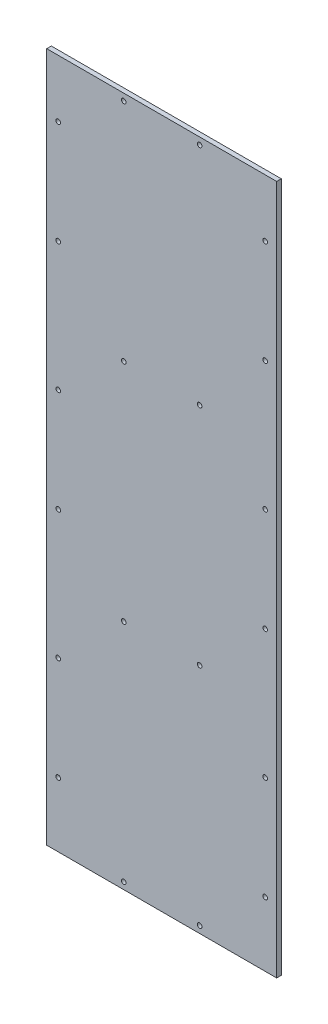
ISO-10303-21;
HEADER;
FILE_DESCRIPTION(('STEP AP214'),'2;1');
FILE_NAME('part.step','',(''),(''),'','','');
FILE_SCHEMA(('AUTOMOTIVE_DESIGN { 1 0 10303 214 1 1 1 1 }'));
ENDSEC;
DATA;
#1=APPLICATION_CONTEXT('core data for automotive mechanical design processes');
#2=APPLICATION_PROTOCOL_DEFINITION('international standard','automotive_design',2000,#1);
#3=PRODUCT_CONTEXT('',#1,'mechanical');
#4=PRODUCT('Part','Part','',(#3));
#5=PRODUCT_RELATED_PRODUCT_CATEGORY('part','',(#4));
#6=PRODUCT_DEFINITION_FORMATION('','',#4);
#7=PRODUCT_DEFINITION_CONTEXT('part definition',#1,'design');
#8=PRODUCT_DEFINITION('design','',#6,#7);
#9=PRODUCT_DEFINITION_SHAPE('','',#8);
#10=(LENGTH_UNIT() NAMED_UNIT(*) SI_UNIT(.MILLI.,.METRE.));
#11=(NAMED_UNIT(*) PLANE_ANGLE_UNIT() SI_UNIT($,.RADIAN.));
#12=(NAMED_UNIT(*) SI_UNIT($,.STERADIAN.) SOLID_ANGLE_UNIT());
#13=UNCERTAINTY_MEASURE_WITH_UNIT(LENGTH_MEASURE(1.E-05),#10,'distance_accuracy_value','');
#14=(GEOMETRIC_REPRESENTATION_CONTEXT(3) GLOBAL_UNCERTAINTY_ASSIGNED_CONTEXT((#13)) GLOBAL_UNIT_ASSIGNED_CONTEXT((#10,
#11,#12)) REPRESENTATION_CONTEXT('',''));
#15=CARTESIAN_POINT('',(0.,0.,0.));
#16=DIRECTION('',(0.,0.,1.));
#17=DIRECTION('',(1.,0.,0.));
#18=AXIS2_PLACEMENT_3D('',#15,#16,#17);
#19=CARTESIAN_POINT('',(-50.,-150.,2.));
#20=DIRECTION('',(1.,0.,0.));
#21=DIRECTION('',(0.,0.,-1.));
#22=AXIS2_PLACEMENT_3D('',#19,#20,#21);
#23=PLANE('',#22);
#24=DIRECTION('',(0.,-1.,0.));
#25=VECTOR('',#24,1.);
#26=CARTESIAN_POINT('',(-50.,-150.,0.));
#27=LINE('',#26,#25);
#28=CARTESIAN_POINT('',(-50.,150.,0.));
#29=VERTEX_POINT('',#28);
#30=CARTESIAN_POINT('',(-50.,-150.,0.));
#31=VERTEX_POINT('',#30);
#32=EDGE_CURVE('E104',#29,#31,#27,.T.);
#33=ORIENTED_EDGE('',*,*,#32,.T.);
#34=DIRECTION('',(0.,0.,-1.));
#35=VECTOR('',#34,1.);
#36=CARTESIAN_POINT('',(-50.,-150.,2.));
#37=LINE('',#36,#35);
#38=CARTESIAN_POINT('',(-50.,-150.,2.));
#39=VERTEX_POINT('',#38);
#40=EDGE_CURVE('E11',#39,#31,#37,.T.);
#41=ORIENTED_EDGE('',*,*,#40,.F.);
#42=DIRECTION('',(0.,-1.,0.));
#43=VECTOR('',#42,1.);
#44=CARTESIAN_POINT('',(-50.,-150.,2.));
#45=LINE('',#44,#43);
#46=CARTESIAN_POINT('',(-50.,150.,2.));
#47=VERTEX_POINT('',#46);
#48=EDGE_CURVE('E91',#47,#39,#45,.T.);
#49=ORIENTED_EDGE('',*,*,#48,.F.);
#50=DIRECTION('',(0.,0.,-1.));
#51=VECTOR('',#50,1.);
#52=CARTESIAN_POINT('',(-50.,150.,2.));
#53=LINE('',#52,#51);
#54=EDGE_CURVE('E100',#47,#29,#53,.T.);
#55=ORIENTED_EDGE('',*,*,#54,.T.);
#56=EDGE_LOOP('',(#33,#41,#49,#55));
#57=FACE_BOUND('',#56,.T.);
#58=ADVANCED_FACE('F38',(#57),#23,.F.);
#59=CARTESIAN_POINT('',(50.,-150.,2.));
#60=DIRECTION('',(0.,1.,0.));
#61=DIRECTION('',(0.,0.,1.));
#62=AXIS2_PLACEMENT_3D('',#59,#60,#61);
#63=PLANE('',#62);
#64=DIRECTION('',(1.,0.,0.));
#65=VECTOR('',#64,1.);
#66=CARTESIAN_POINT('',(50.,-150.,0.));
#67=LINE('',#66,#65);
#68=CARTESIAN_POINT('',(50.,-150.,0.));
#69=VERTEX_POINT('',#68);
#70=EDGE_CURVE('E95',#31,#69,#67,.T.);
#71=ORIENTED_EDGE('',*,*,#70,.T.);
#72=DIRECTION('',(0.,0.,-1.));
#73=VECTOR('',#72,1.);
#74=CARTESIAN_POINT('',(50.,-150.,2.));
#75=LINE('',#74,#73);
#76=CARTESIAN_POINT('',(50.,-150.,2.));
#77=VERTEX_POINT('',#76);
#78=EDGE_CURVE('E47',#77,#69,#75,.T.);
#79=ORIENTED_EDGE('',*,*,#78,.F.);
#80=DIRECTION('',(1.,0.,0.));
#81=VECTOR('',#80,1.);
#82=CARTESIAN_POINT('',(50.,-150.,2.));
#83=LINE('',#82,#81);
#84=EDGE_CURVE('E86',#39,#77,#83,.T.);
#85=ORIENTED_EDGE('',*,*,#84,.F.);
#86=ORIENTED_EDGE('',*,*,#40,.T.);
#87=EDGE_LOOP('',(#71,#79,#85,#86));
#88=FACE_BOUND('',#87,.T.);
#89=ADVANCED_FACE('F94',(#88),#63,.F.);
#90=CARTESIAN_POINT('',(50.,-150.,2.));
#91=DIRECTION('',(-1.,0.,0.));
#92=DIRECTION('',(0.,0.,1.));
#93=AXIS2_PLACEMENT_3D('',#90,#91,#92);
#94=PLANE('',#93);
#95=DIRECTION('',(0.,1.,0.));
#96=VECTOR('',#95,1.);
#97=CARTESIAN_POINT('',(50.,-150.,0.));
#98=LINE('',#97,#96);
#99=CARTESIAN_POINT('',(50.,150.,0.));
#100=VERTEX_POINT('',#99);
#101=EDGE_CURVE('E73',#69,#100,#98,.T.);
#102=ORIENTED_EDGE('',*,*,#101,.T.);
#103=DIRECTION('',(0.,0.,-1.));
#104=VECTOR('',#103,1.);
#105=CARTESIAN_POINT('',(50.,150.,2.));
#106=LINE('',#105,#104);
#107=CARTESIAN_POINT('',(50.,150.,2.));
#108=VERTEX_POINT('',#107);
#109=EDGE_CURVE('E96',#108,#100,#106,.T.);
#110=ORIENTED_EDGE('',*,*,#109,.F.);
#111=DIRECTION('',(0.,1.,0.));
#112=VECTOR('',#111,1.);
#113=CARTESIAN_POINT('',(50.,-150.,2.));
#114=LINE('',#113,#112);
#115=EDGE_CURVE('E89',#77,#108,#114,.T.);
#116=ORIENTED_EDGE('',*,*,#115,.F.);
#117=ORIENTED_EDGE('',*,*,#78,.T.);
#118=EDGE_LOOP('',(#102,#110,#116,#117));
#119=FACE_BOUND('',#118,.T.);
#120=ADVANCED_FACE('F98',(#119),#94,.F.);
#121=CARTESIAN_POINT('',(50.,150.,2.));
#122=DIRECTION('',(0.,-1.,0.));
#123=DIRECTION('',(1.,0.,0.));
#124=AXIS2_PLACEMENT_3D('',#121,#122,#123);
#125=PLANE('',#124);
#126=DIRECTION('',(-1.,0.,0.));
#127=VECTOR('',#126,1.);
#128=CARTESIAN_POINT('',(50.,150.,0.));
#129=LINE('',#128,#127);
#130=EDGE_CURVE('E79',#100,#29,#129,.T.);
#131=ORIENTED_EDGE('',*,*,#130,.T.);
#132=ORIENTED_EDGE('',*,*,#54,.F.);
#133=DIRECTION('',(-1.,0.,0.));
#134=VECTOR('',#133,1.);
#135=CARTESIAN_POINT('',(50.,150.,2.));
#136=LINE('',#135,#134);
#137=EDGE_CURVE('E56',#108,#47,#136,.T.);
#138=ORIENTED_EDGE('',*,*,#137,.F.);
#139=ORIENTED_EDGE('',*,*,#109,.T.);
#140=EDGE_LOOP('',(#131,#132,#138,#139));
#141=FACE_BOUND('',#140,.T.);
#142=ADVANCED_FACE('F205',(#141),#125,.F.);
#143=CARTESIAN_POINT('',(0.,0.,2.));
#144=DIRECTION('',(0.,0.,1.));
#145=DIRECTION('',(1.,0.,0.));
#146=AXIS2_PLACEMENT_3D('',#143,#144,#145);
#147=PLANE('',#146);
#148=CARTESIAN_POINT('',(16.5,-147.,2.));
#149=DIRECTION('',(0.,0.,1.));
#150=DIRECTION('',(1.,0.,0.));
#151=AXIS2_PLACEMENT_3D('',#148,#149,#150);
#152=CIRCLE('',#151,1.);
#153=CARTESIAN_POINT('',(17.5,-147.,2.));
#154=VERTEX_POINT('',#153);
#155=EDGE_CURVE('E480',#154,#154,#152,.T.);
#156=ORIENTED_EDGE('',*,*,#155,.F.);
#157=EDGE_LOOP('',(#156));
#158=FACE_BOUND('',#157,.T.);
#159=CARTESIAN_POINT('',(45.0000000000049,-122.,2.));
#160=DIRECTION('',(0.,0.,1.));
#161=DIRECTION('',(1.,0.,0.));
#162=AXIS2_PLACEMENT_3D('',#159,#160,#161);
#163=CIRCLE('',#162,0.999999999999998);
#164=CARTESIAN_POINT('',(46.0000000000049,-122.,2.));
#165=VERTEX_POINT('',#164);
#166=EDGE_CURVE('E474',#165,#165,#163,.T.);
#167=ORIENTED_EDGE('',*,*,#166,.F.);
#168=EDGE_LOOP('',(#167));
#169=FACE_BOUND('',#168,.T.);
#170=CARTESIAN_POINT('',(45.0000000000049,-77.,2.));
#171=DIRECTION('',(0.,0.,1.));
#172=DIRECTION('',(1.,0.,0.));
#173=AXIS2_PLACEMENT_3D('',#170,#171,#172);
#174=CIRCLE('',#173,0.999999999999998);
#175=CARTESIAN_POINT('',(46.0000000000049,-77.,2.));
#176=VERTEX_POINT('',#175);
#177=EDGE_CURVE('E418',#176,#176,#174,.T.);
#178=ORIENTED_EDGE('',*,*,#177,.F.);
#179=EDGE_LOOP('',(#178));
#180=FACE_BOUND('',#179,.T.);
#181=CARTESIAN_POINT('',(-44.999999999995,-122.,2.));
#182=DIRECTION('',(0.,0.,1.));
#183=DIRECTION('',(1.,0.,0.));
#184=AXIS2_PLACEMENT_3D('',#181,#182,#183);
#185=CIRCLE('',#184,0.999999999999998);
#186=CARTESIAN_POINT('',(-43.999999999995,-122.,2.));
#187=VERTEX_POINT('',#186);
#188=EDGE_CURVE('E473',#187,#187,#185,.T.);
#189=ORIENTED_EDGE('',*,*,#188,.F.);
#190=EDGE_LOOP('',(#189));
#191=FACE_BOUND('',#190,.T.);
#192=CARTESIAN_POINT('',(16.4999999999993,49.,2.));
#193=DIRECTION('',(0.,0.,1.));
#194=DIRECTION('',(1.,0.,0.));
#195=AXIS2_PLACEMENT_3D('',#192,#193,#194);
#196=CIRCLE('',#195,1.);
#197=CARTESIAN_POINT('',(17.4999999999993,49.,2.));
#198=VERTEX_POINT('',#197);
#199=EDGE_CURVE('E534',#198,#198,#196,.T.);
#200=ORIENTED_EDGE('',*,*,#199,.F.);
#201=EDGE_LOOP('',(#200));
#202=FACE_BOUND('',#201,.T.);
#203=CARTESIAN_POINT('',(-16.5000000000004,-49.,2.));
#204=DIRECTION('',(0.,0.,1.));
#205=DIRECTION('',(-1.,0.,0.));
#206=AXIS2_PLACEMENT_3D('',#203,#204,#205);
#207=CIRCLE('',#206,1.);
#208=CARTESIAN_POINT('',(-17.5000000000004,-49.,2.));
#209=VERTEX_POINT('',#208);
#210=EDGE_CURVE('E537',#209,#209,#207,.T.);
#211=ORIENTED_EDGE('',*,*,#210,.F.);
#212=EDGE_LOOP('',(#211));
#213=FACE_BOUND('',#212,.T.);
#214=CARTESIAN_POINT('',(-16.5,-147.,2.));
#215=DIRECTION('',(0.,0.,1.));
#216=DIRECTION('',(-1.,0.,0.));
#217=AXIS2_PLACEMENT_3D('',#214,#215,#216);
#218=CIRCLE('',#217,1.);
#219=CARTESIAN_POINT('',(-17.5,-147.,2.));
#220=VERTEX_POINT('',#219);
#221=EDGE_CURVE('E543',#220,#220,#218,.T.);
#222=ORIENTED_EDGE('',*,*,#221,.F.);
#223=EDGE_LOOP('',(#222));
#224=FACE_BOUND('',#223,.T.);
#225=CARTESIAN_POINT('',(16.4999999999997,-49.,2.));
#226=DIRECTION('',(0.,0.,1.));
#227=DIRECTION('',(1.,0.,0.));
#228=AXIS2_PLACEMENT_3D('',#225,#226,#227);
#229=CIRCLE('',#228,1.);
#230=CARTESIAN_POINT('',(17.4999999999997,-49.,2.));
#231=VERTEX_POINT('',#230);
#232=EDGE_CURVE('E545',#231,#231,#229,.T.);
#233=ORIENTED_EDGE('',*,*,#232,.F.);
#234=EDGE_LOOP('',(#233));
#235=FACE_BOUND('',#234,.T.);
#236=CARTESIAN_POINT('',(-44.9999999999975,24.,2.));
#237=DIRECTION('',(0.,0.,1.));
#238=DIRECTION('',(1.,0.,0.));
#239=AXIS2_PLACEMENT_3D('',#236,#237,#238);
#240=CIRCLE('',#239,0.999999999999998);
#241=CARTESIAN_POINT('',(-43.9999999999975,24.,2.));
#242=VERTEX_POINT('',#241);
#243=EDGE_CURVE('E493',#242,#242,#240,.T.);
#244=ORIENTED_EDGE('',*,*,#243,.F.);
#245=EDGE_LOOP('',(#244));
#246=FACE_BOUND('',#245,.T.);
#247=CARTESIAN_POINT('',(44.9999999999999,80.,2.));
#248=DIRECTION('',(0.,0.,1.));
#249=DIRECTION('',(1.,0.,0.));
#250=AXIS2_PLACEMENT_3D('',#247,#248,#249);
#251=CIRCLE('',#250,0.999999999999998);
#252=CARTESIAN_POINT('',(45.9999999999999,80.,2.));
#253=VERTEX_POINT('',#252);
#254=EDGE_CURVE('E496',#253,#253,#251,.T.);
#255=ORIENTED_EDGE('',*,*,#254,.F.);
#256=EDGE_LOOP('',(#255));
#257=FACE_BOUND('',#256,.T.);
#258=CARTESIAN_POINT('',(45.,125.,2.));
#259=DIRECTION('',(0.,0.,1.));
#260=DIRECTION('',(1.,0.,0.));
#261=AXIS2_PLACEMENT_3D('',#258,#259,#260);
#262=CIRCLE('',#261,0.999999999999998);
#263=CARTESIAN_POINT('',(46.,125.,2.));
#264=VERTEX_POINT('',#263);
#265=EDGE_CURVE('E499',#264,#264,#262,.T.);
#266=ORIENTED_EDGE('',*,*,#265,.F.);
#267=EDGE_LOOP('',(#266));
#268=FACE_BOUND('',#267,.T.);
#269=CARTESIAN_POINT('',(-45.,80.,2.));
#270=DIRECTION('',(0.,0.,1.));
#271=DIRECTION('',(1.,0.,0.));
#272=AXIS2_PLACEMENT_3D('',#269,#270,#271);
#273=CIRCLE('',#272,0.999999999999998);
#274=CARTESIAN_POINT('',(-44.,80.,2.));
#275=VERTEX_POINT('',#274);
#276=EDGE_CURVE('E502',#275,#275,#273,.T.);
#277=ORIENTED_EDGE('',*,*,#276,.F.);
#278=EDGE_LOOP('',(#277));
#279=FACE_BOUND('',#278,.T.);
#280=CARTESIAN_POINT('',(-44.999999999995,-77.,2.));
#281=DIRECTION('',(0.,0.,1.));
#282=DIRECTION('',(1.,0.,0.));
#283=AXIS2_PLACEMENT_3D('',#280,#281,#282);
#284=CIRCLE('',#283,0.999999999999998);
#285=CARTESIAN_POINT('',(-43.999999999995,-77.,2.));
#286=VERTEX_POINT('',#285);
#287=EDGE_CURVE('E477',#286,#286,#284,.T.);
#288=ORIENTED_EDGE('',*,*,#287,.F.);
#289=EDGE_LOOP('',(#288));
#290=FACE_BOUND('',#289,.T.);
#291=CARTESIAN_POINT('',(45.0000000000024,-21.,2.));
#292=DIRECTION('',(0.,0.,1.));
#293=DIRECTION('',(1.,0.,0.));
#294=AXIS2_PLACEMENT_3D('',#291,#292,#293);
#295=CIRCLE('',#294,0.999999999999998);
#296=CARTESIAN_POINT('',(46.0000000000024,-21.,2.));
#297=VERTEX_POINT('',#296);
#298=EDGE_CURVE('E484',#297,#297,#295,.T.);
#299=ORIENTED_EDGE('',*,*,#298,.F.);
#300=EDGE_LOOP('',(#299));
#301=FACE_BOUND('',#300,.T.);
#302=CARTESIAN_POINT('',(45.0000000000024,24.,2.));
#303=DIRECTION('',(0.,0.,1.));
#304=DIRECTION('',(1.,0.,0.));
#305=AXIS2_PLACEMENT_3D('',#302,#303,#304);
#306=CIRCLE('',#305,0.999999999999998);
#307=CARTESIAN_POINT('',(46.0000000000024,24.,2.));
#308=VERTEX_POINT('',#307);
#309=EDGE_CURVE('E487',#308,#308,#306,.T.);
#310=ORIENTED_EDGE('',*,*,#309,.F.);
#311=EDGE_LOOP('',(#310));
#312=FACE_BOUND('',#311,.T.);
#313=CARTESIAN_POINT('',(-44.9999999999975,-21.,2.));
#314=DIRECTION('',(0.,0.,1.));
#315=DIRECTION('',(1.,0.,0.));
#316=AXIS2_PLACEMENT_3D('',#313,#314,#315);
#317=CIRCLE('',#316,0.999999999999998);
#318=CARTESIAN_POINT('',(-43.9999999999975,-21.,2.));
#319=VERTEX_POINT('',#318);
#320=EDGE_CURVE('E490',#319,#319,#317,.T.);
#321=ORIENTED_EDGE('',*,*,#320,.F.);
#322=EDGE_LOOP('',(#321));
#323=FACE_BOUND('',#322,.T.);
#324=CARTESIAN_POINT('',(-16.500000000001,147.,2.));
#325=DIRECTION('',(0.,0.,1.));
#326=DIRECTION('',(-1.,0.,0.));
#327=AXIS2_PLACEMENT_3D('',#324,#325,#326);
#328=CIRCLE('',#327,1.);
#329=CARTESIAN_POINT('',(-17.500000000001,147.,2.));
#330=VERTEX_POINT('',#329);
#331=EDGE_CURVE('E526',#330,#330,#328,.T.);
#332=ORIENTED_EDGE('',*,*,#331,.F.);
#333=EDGE_LOOP('',(#332));
#334=FACE_BOUND('',#333,.T.);
#335=CARTESIAN_POINT('',(16.499999999999,147.,2.));
#336=DIRECTION('',(0.,0.,1.));
#337=DIRECTION('',(1.,0.,0.));
#338=AXIS2_PLACEMENT_3D('',#335,#336,#337);
#339=CIRCLE('',#338,1.);
#340=CARTESIAN_POINT('',(17.499999999999,147.,2.));
#341=VERTEX_POINT('',#340);
#342=EDGE_CURVE('E530',#341,#341,#339,.T.);
#343=ORIENTED_EDGE('',*,*,#342,.F.);
#344=EDGE_LOOP('',(#343));
#345=FACE_BOUND('',#344,.T.);
#346=CARTESIAN_POINT('',(-16.5000000000007,49.,2.));
#347=DIRECTION('',(0.,0.,1.));
#348=DIRECTION('',(-1.,0.,0.));
#349=AXIS2_PLACEMENT_3D('',#346,#347,#348);
#350=CIRCLE('',#349,1.);
#351=CARTESIAN_POINT('',(-17.5000000000007,49.,2.));
#352=VERTEX_POINT('',#351);
#353=EDGE_CURVE('E533',#352,#352,#350,.T.);
#354=ORIENTED_EDGE('',*,*,#353,.F.);
#355=EDGE_LOOP('',(#354));
#356=FACE_BOUND('',#355,.T.);
#357=CARTESIAN_POINT('',(-45.,125.,2.));
#358=DIRECTION('',(0.,0.,1.));
#359=DIRECTION('',(1.,0.,0.));
#360=AXIS2_PLACEMENT_3D('',#357,#358,#359);
#361=CIRCLE('',#360,0.999999999999998);
#362=CARTESIAN_POINT('',(-44.,125.,2.));
#363=VERTEX_POINT('',#362);
#364=EDGE_CURVE('E116',#363,#363,#361,.T.);
#365=ORIENTED_EDGE('',*,*,#364,.F.);
#366=EDGE_LOOP('',(#365));
#367=FACE_BOUND('',#366,.T.);
#368=ORIENTED_EDGE('',*,*,#48,.T.);
#369=ORIENTED_EDGE('',*,*,#84,.T.);
#370=ORIENTED_EDGE('',*,*,#115,.T.);
#371=ORIENTED_EDGE('',*,*,#137,.T.);
#372=EDGE_LOOP('',(#368,#369,#370,#371));
#373=FACE_BOUND('',#372,.T.);
#374=ADVANCED_FACE('F87',(#158,#169,#180,#191,#202,#213,#224,#235,#246,#257,#268,#279,#290,#301,
#312,#323,#334,#345,#356,#367,#373),#147,.T.);
#375=CARTESIAN_POINT('',(0.,0.,0.));
#376=DIRECTION('',(0.,0.,1.));
#377=DIRECTION('',(1.,0.,0.));
#378=AXIS2_PLACEMENT_3D('',#375,#376,#377);
#379=PLANE('',#378);
#380=CARTESIAN_POINT('',(16.5,-147.,0.));
#381=DIRECTION('',(0.,0.,1.));
#382=DIRECTION('',(1.,0.,0.));
#383=AXIS2_PLACEMENT_3D('',#380,#381,#382);
#384=CIRCLE('',#383,1.);
#385=CARTESIAN_POINT('',(17.5,-147.,0.));
#386=VERTEX_POINT('',#385);
#387=EDGE_CURVE('E41',#386,#386,#384,.T.);
#388=ORIENTED_EDGE('',*,*,#387,.T.);
#389=EDGE_LOOP('',(#388));
#390=FACE_BOUND('',#389,.T.);
#391=CARTESIAN_POINT('',(45.0000000000049,-122.,0.));
#392=DIRECTION('',(0.,0.,1.));
#393=DIRECTION('',(1.,0.,0.));
#394=AXIS2_PLACEMENT_3D('',#391,#392,#393);
#395=CIRCLE('',#394,0.999999999999998);
#396=CARTESIAN_POINT('',(46.0000000000049,-122.,0.));
#397=VERTEX_POINT('',#396);
#398=EDGE_CURVE('E166',#397,#397,#395,.T.);
#399=ORIENTED_EDGE('',*,*,#398,.T.);
#400=EDGE_LOOP('',(#399));
#401=FACE_BOUND('',#400,.T.);
#402=CARTESIAN_POINT('',(45.0000000000049,-77.,0.));
#403=DIRECTION('',(0.,0.,1.));
#404=DIRECTION('',(1.,0.,0.));
#405=AXIS2_PLACEMENT_3D('',#402,#403,#404);
#406=CIRCLE('',#405,0.999999999999998);
#407=CARTESIAN_POINT('',(46.0000000000049,-77.,0.));
#408=VERTEX_POINT('',#407);
#409=EDGE_CURVE('E164',#408,#408,#406,.T.);
#410=ORIENTED_EDGE('',*,*,#409,.T.);
#411=EDGE_LOOP('',(#410));
#412=FACE_BOUND('',#411,.T.);
#413=CARTESIAN_POINT('',(-44.999999999995,-122.,0.));
#414=DIRECTION('',(0.,0.,1.));
#415=DIRECTION('',(1.,0.,0.));
#416=AXIS2_PLACEMENT_3D('',#413,#414,#415);
#417=CIRCLE('',#416,0.999999999999998);
#418=CARTESIAN_POINT('',(-43.999999999995,-122.,0.));
#419=VERTEX_POINT('',#418);
#420=EDGE_CURVE('E161',#419,#419,#417,.T.);
#421=ORIENTED_EDGE('',*,*,#420,.T.);
#422=EDGE_LOOP('',(#421));
#423=FACE_BOUND('',#422,.T.);
#424=CARTESIAN_POINT('',(16.4999999999993,49.,0.));
#425=DIRECTION('',(0.,0.,1.));
#426=DIRECTION('',(1.,0.,0.));
#427=AXIS2_PLACEMENT_3D('',#424,#425,#426);
#428=CIRCLE('',#427,1.);
#429=CARTESIAN_POINT('',(17.4999999999993,49.,0.));
#430=VERTEX_POINT('',#429);
#431=EDGE_CURVE('E158',#430,#430,#428,.T.);
#432=ORIENTED_EDGE('',*,*,#431,.T.);
#433=EDGE_LOOP('',(#432));
#434=FACE_BOUND('',#433,.T.);
#435=CARTESIAN_POINT('',(-16.5000000000004,-49.,0.));
#436=DIRECTION('',(0.,0.,1.));
#437=DIRECTION('',(1.,0.,0.));
#438=AXIS2_PLACEMENT_3D('',#435,#436,#437);
#439=CIRCLE('',#438,1.);
#440=CARTESIAN_POINT('',(-15.5000000000003,-49.,0.));
#441=VERTEX_POINT('',#440);
#442=EDGE_CURVE('E155',#441,#441,#439,.T.);
#443=ORIENTED_EDGE('',*,*,#442,.T.);
#444=EDGE_LOOP('',(#443));
#445=FACE_BOUND('',#444,.T.);
#446=CARTESIAN_POINT('',(-16.5,-147.,0.));
#447=DIRECTION('',(0.,0.,1.));
#448=DIRECTION('',(1.,0.,0.));
#449=AXIS2_PLACEMENT_3D('',#446,#447,#448);
#450=CIRCLE('',#449,1.);
#451=CARTESIAN_POINT('',(-15.5,-147.,0.));
#452=VERTEX_POINT('',#451);
#453=EDGE_CURVE('E152',#452,#452,#450,.T.);
#454=ORIENTED_EDGE('',*,*,#453,.T.);
#455=EDGE_LOOP('',(#454));
#456=FACE_BOUND('',#455,.T.);
#457=CARTESIAN_POINT('',(16.4999999999997,-49.,0.));
#458=DIRECTION('',(0.,0.,1.));
#459=DIRECTION('',(1.,0.,0.));
#460=AXIS2_PLACEMENT_3D('',#457,#458,#459);
#461=CIRCLE('',#460,1.);
#462=CARTESIAN_POINT('',(17.4999999999997,-49.,0.));
#463=VERTEX_POINT('',#462);
#464=EDGE_CURVE('E149',#463,#463,#461,.T.);
#465=ORIENTED_EDGE('',*,*,#464,.T.);
#466=EDGE_LOOP('',(#465));
#467=FACE_BOUND('',#466,.T.);
#468=CARTESIAN_POINT('',(-44.9999999999975,24.,0.));
#469=DIRECTION('',(0.,0.,1.));
#470=DIRECTION('',(1.,0.,0.));
#471=AXIS2_PLACEMENT_3D('',#468,#469,#470);
#472=CIRCLE('',#471,0.999999999999998);
#473=CARTESIAN_POINT('',(-43.9999999999975,24.,0.));
#474=VERTEX_POINT('',#473);
#475=EDGE_CURVE('E146',#474,#474,#472,.T.);
#476=ORIENTED_EDGE('',*,*,#475,.T.);
#477=EDGE_LOOP('',(#476));
#478=FACE_BOUND('',#477,.T.);
#479=CARTESIAN_POINT('',(44.9999999999999,80.,0.));
#480=DIRECTION('',(0.,0.,1.));
#481=DIRECTION('',(1.,0.,0.));
#482=AXIS2_PLACEMENT_3D('',#479,#480,#481);
#483=CIRCLE('',#482,0.999999999999998);
#484=CARTESIAN_POINT('',(45.9999999999999,80.,0.));
#485=VERTEX_POINT('',#484);
#486=EDGE_CURVE('E143',#485,#485,#483,.T.);
#487=ORIENTED_EDGE('',*,*,#486,.T.);
#488=EDGE_LOOP('',(#487));
#489=FACE_BOUND('',#488,.T.);
#490=CARTESIAN_POINT('',(45.,125.,0.));
#491=DIRECTION('',(0.,0.,1.));
#492=DIRECTION('',(1.,0.,0.));
#493=AXIS2_PLACEMENT_3D('',#490,#491,#492);
#494=CIRCLE('',#493,0.999999999999998);
#495=CARTESIAN_POINT('',(46.,125.,0.));
#496=VERTEX_POINT('',#495);
#497=EDGE_CURVE('E140',#496,#496,#494,.T.);
#498=ORIENTED_EDGE('',*,*,#497,.T.);
#499=EDGE_LOOP('',(#498));
#500=FACE_BOUND('',#499,.T.);
#501=CARTESIAN_POINT('',(-45.,80.,0.));
#502=DIRECTION('',(0.,0.,1.));
#503=DIRECTION('',(1.,0.,0.));
#504=AXIS2_PLACEMENT_3D('',#501,#502,#503);
#505=CIRCLE('',#504,0.999999999999998);
#506=CARTESIAN_POINT('',(-44.,80.,0.));
#507=VERTEX_POINT('',#506);
#508=EDGE_CURVE('E137',#507,#507,#505,.T.);
#509=ORIENTED_EDGE('',*,*,#508,.T.);
#510=EDGE_LOOP('',(#509));
#511=FACE_BOUND('',#510,.T.);
#512=CARTESIAN_POINT('',(-44.999999999995,-77.,0.));
#513=DIRECTION('',(0.,0.,1.));
#514=DIRECTION('',(1.,0.,0.));
#515=AXIS2_PLACEMENT_3D('',#512,#513,#514);
#516=CIRCLE('',#515,0.999999999999998);
#517=CARTESIAN_POINT('',(-43.999999999995,-77.,0.));
#518=VERTEX_POINT('',#517);
#519=EDGE_CURVE('E134',#518,#518,#516,.T.);
#520=ORIENTED_EDGE('',*,*,#519,.T.);
#521=EDGE_LOOP('',(#520));
#522=FACE_BOUND('',#521,.T.);
#523=CARTESIAN_POINT('',(45.0000000000024,-21.,0.));
#524=DIRECTION('',(0.,0.,1.));
#525=DIRECTION('',(1.,0.,0.));
#526=AXIS2_PLACEMENT_3D('',#523,#524,#525);
#527=CIRCLE('',#526,0.999999999999998);
#528=CARTESIAN_POINT('',(46.0000000000024,-21.,0.));
#529=VERTEX_POINT('',#528);
#530=EDGE_CURVE('E131',#529,#529,#527,.T.);
#531=ORIENTED_EDGE('',*,*,#530,.T.);
#532=EDGE_LOOP('',(#531));
#533=FACE_BOUND('',#532,.T.);
#534=CARTESIAN_POINT('',(45.0000000000024,24.,0.));
#535=DIRECTION('',(0.,0.,1.));
#536=DIRECTION('',(1.,0.,0.));
#537=AXIS2_PLACEMENT_3D('',#534,#535,#536);
#538=CIRCLE('',#537,0.999999999999998);
#539=CARTESIAN_POINT('',(46.0000000000024,24.,0.));
#540=VERTEX_POINT('',#539);
#541=EDGE_CURVE('E128',#540,#540,#538,.T.);
#542=ORIENTED_EDGE('',*,*,#541,.T.);
#543=EDGE_LOOP('',(#542));
#544=FACE_BOUND('',#543,.T.);
#545=CARTESIAN_POINT('',(-44.9999999999975,-21.,0.));
#546=DIRECTION('',(0.,0.,1.));
#547=DIRECTION('',(1.,0.,0.));
#548=AXIS2_PLACEMENT_3D('',#545,#546,#547);
#549=CIRCLE('',#548,0.999999999999998);
#550=CARTESIAN_POINT('',(-43.9999999999975,-21.,0.));
#551=VERTEX_POINT('',#550);
#552=EDGE_CURVE('E125',#551,#551,#549,.T.);
#553=ORIENTED_EDGE('',*,*,#552,.T.);
#554=EDGE_LOOP('',(#553));
#555=FACE_BOUND('',#554,.T.);
#556=CARTESIAN_POINT('',(-16.500000000001,147.,0.));
#557=DIRECTION('',(0.,0.,1.));
#558=DIRECTION('',(1.,0.,0.));
#559=AXIS2_PLACEMENT_3D('',#556,#557,#558);
#560=CIRCLE('',#559,1.);
#561=CARTESIAN_POINT('',(-15.500000000001,147.,0.));
#562=VERTEX_POINT('',#561);
#563=EDGE_CURVE('E122',#562,#562,#560,.T.);
#564=ORIENTED_EDGE('',*,*,#563,.T.);
#565=EDGE_LOOP('',(#564));
#566=FACE_BOUND('',#565,.T.);
#567=CARTESIAN_POINT('',(16.499999999999,147.,0.));
#568=DIRECTION('',(0.,0.,1.));
#569=DIRECTION('',(1.,0.,0.));
#570=AXIS2_PLACEMENT_3D('',#567,#568,#569);
#571=CIRCLE('',#570,1.);
#572=CARTESIAN_POINT('',(17.499999999999,147.,0.));
#573=VERTEX_POINT('',#572);
#574=EDGE_CURVE('E119',#573,#573,#571,.T.);
#575=ORIENTED_EDGE('',*,*,#574,.T.);
#576=EDGE_LOOP('',(#575));
#577=FACE_BOUND('',#576,.T.);
#578=CARTESIAN_POINT('',(-16.5000000000007,49.,0.));
#579=DIRECTION('',(0.,0.,1.));
#580=DIRECTION('',(1.,0.,0.));
#581=AXIS2_PLACEMENT_3D('',#578,#579,#580);
#582=CIRCLE('',#581,1.);
#583=CARTESIAN_POINT('',(-15.5000000000007,49.,0.));
#584=VERTEX_POINT('',#583);
#585=EDGE_CURVE('E115',#584,#584,#582,.T.);
#586=ORIENTED_EDGE('',*,*,#585,.T.);
#587=EDGE_LOOP('',(#586));
#588=FACE_BOUND('',#587,.T.);
#589=CARTESIAN_POINT('',(-45.,125.,0.));
#590=DIRECTION('',(0.,0.,1.));
#591=DIRECTION('',(1.,0.,0.));
#592=AXIS2_PLACEMENT_3D('',#589,#590,#591);
#593=CIRCLE('',#592,0.999999999999998);
#594=CARTESIAN_POINT('',(-44.,125.,0.));
#595=VERTEX_POINT('',#594);
#596=EDGE_CURVE('E112',#595,#595,#593,.T.);
#597=ORIENTED_EDGE('',*,*,#596,.T.);
#598=EDGE_LOOP('',(#597));
#599=FACE_BOUND('',#598,.T.);
#600=ORIENTED_EDGE('',*,*,#32,.F.);
#601=ORIENTED_EDGE('',*,*,#130,.F.);
#602=ORIENTED_EDGE('',*,*,#101,.F.);
#603=ORIENTED_EDGE('',*,*,#70,.F.);
#604=EDGE_LOOP('',(#600,#601,#602,#603));
#605=FACE_BOUND('',#604,.T.);
#606=ADVANCED_FACE('F173',(#390,#401,#412,#423,#434,#445,#456,#467,#478,#489,#500,#511,#522,
#533,#544,#555,#566,#577,#588,#599,#605),#379,.F.);
#607=CARTESIAN_POINT('',(-45.,125.,-23.));
#608=DIRECTION('',(0.,0.,1.));
#609=DIRECTION('',(1.,0.,0.));
#610=AXIS2_PLACEMENT_3D('',#607,#608,#609);
#611=CYLINDRICAL_SURFACE('',#610,0.999999999999998);
#612=ORIENTED_EDGE('',*,*,#364,.T.);
#613=EDGE_LOOP('',(#612));
#614=FACE_BOUND('',#613,.T.);
#615=ORIENTED_EDGE('',*,*,#596,.F.);
#616=EDGE_LOOP('',(#615));
#617=FACE_BOUND('',#616,.T.);
#618=ADVANCED_FACE('F196',(#614,#617),#611,.F.);
#619=CARTESIAN_POINT('',(-16.5000000000007,49.,-23.));
#620=DIRECTION('',(0.,0.,1.));
#621=DIRECTION('',(1.,0.,0.));
#622=AXIS2_PLACEMENT_3D('',#619,#620,#621);
#623=CYLINDRICAL_SURFACE('',#622,1.);
#624=ORIENTED_EDGE('',*,*,#353,.T.);
#625=EDGE_LOOP('',(#624));
#626=FACE_BOUND('',#625,.T.);
#627=ORIENTED_EDGE('',*,*,#585,.F.);
#628=EDGE_LOOP('',(#627));
#629=FACE_BOUND('',#628,.T.);
#630=ADVANCED_FACE('F202',(#626,#629),#623,.F.);
#631=CARTESIAN_POINT('',(16.499999999999,147.,-23.));
#632=DIRECTION('',(0.,0.,1.));
#633=DIRECTION('',(1.,0.,0.));
#634=AXIS2_PLACEMENT_3D('',#631,#632,#633);
#635=CYLINDRICAL_SURFACE('',#634,1.);
#636=ORIENTED_EDGE('',*,*,#342,.T.);
#637=EDGE_LOOP('',(#636));
#638=FACE_BOUND('',#637,.T.);
#639=ORIENTED_EDGE('',*,*,#574,.F.);
#640=EDGE_LOOP('',(#639));
#641=FACE_BOUND('',#640,.T.);
#642=ADVANCED_FACE('F243',(#638,#641),#635,.F.);
#643=CARTESIAN_POINT('',(-16.500000000001,147.,-23.));
#644=DIRECTION('',(0.,0.,1.));
#645=DIRECTION('',(1.,0.,0.));
#646=AXIS2_PLACEMENT_3D('',#643,#644,#645);
#647=CYLINDRICAL_SURFACE('',#646,1.);
#648=ORIENTED_EDGE('',*,*,#331,.T.);
#649=EDGE_LOOP('',(#648));
#650=FACE_BOUND('',#649,.T.);
#651=ORIENTED_EDGE('',*,*,#563,.F.);
#652=EDGE_LOOP('',(#651));
#653=FACE_BOUND('',#652,.T.);
#654=ADVANCED_FACE('F253',(#650,#653),#647,.F.);
#655=CARTESIAN_POINT('',(-44.9999999999975,-21.,-23.));
#656=DIRECTION('',(0.,0.,1.));
#657=DIRECTION('',(1.,0.,0.));
#658=AXIS2_PLACEMENT_3D('',#655,#656,#657);
#659=CYLINDRICAL_SURFACE('',#658,0.999999999999998);
#660=ORIENTED_EDGE('',*,*,#320,.T.);
#661=EDGE_LOOP('',(#660));
#662=FACE_BOUND('',#661,.T.);
#663=ORIENTED_EDGE('',*,*,#552,.F.);
#664=EDGE_LOOP('',(#663));
#665=FACE_BOUND('',#664,.T.);
#666=ADVANCED_FACE('F263',(#662,#665),#659,.F.);
#667=CARTESIAN_POINT('',(45.0000000000024,24.,-23.));
#668=DIRECTION('',(0.,0.,1.));
#669=DIRECTION('',(1.,0.,0.));
#670=AXIS2_PLACEMENT_3D('',#667,#668,#669);
#671=CYLINDRICAL_SURFACE('',#670,0.999999999999998);
#672=ORIENTED_EDGE('',*,*,#309,.T.);
#673=EDGE_LOOP('',(#672));
#674=FACE_BOUND('',#673,.T.);
#675=ORIENTED_EDGE('',*,*,#541,.F.);
#676=EDGE_LOOP('',(#675));
#677=FACE_BOUND('',#676,.T.);
#678=ADVANCED_FACE('F273',(#674,#677),#671,.F.);
#679=CARTESIAN_POINT('',(45.0000000000024,-21.,-23.));
#680=DIRECTION('',(0.,0.,1.));
#681=DIRECTION('',(1.,0.,0.));
#682=AXIS2_PLACEMENT_3D('',#679,#680,#681);
#683=CYLINDRICAL_SURFACE('',#682,0.999999999999998);
#684=ORIENTED_EDGE('',*,*,#298,.T.);
#685=EDGE_LOOP('',(#684));
#686=FACE_BOUND('',#685,.T.);
#687=ORIENTED_EDGE('',*,*,#530,.F.);
#688=EDGE_LOOP('',(#687));
#689=FACE_BOUND('',#688,.T.);
#690=ADVANCED_FACE('F283',(#686,#689),#683,.F.);
#691=CARTESIAN_POINT('',(-44.999999999995,-77.,-23.));
#692=DIRECTION('',(0.,0.,1.));
#693=DIRECTION('',(1.,0.,0.));
#694=AXIS2_PLACEMENT_3D('',#691,#692,#693);
#695=CYLINDRICAL_SURFACE('',#694,0.999999999999998);
#696=ORIENTED_EDGE('',*,*,#287,.T.);
#697=EDGE_LOOP('',(#696));
#698=FACE_BOUND('',#697,.T.);
#699=ORIENTED_EDGE('',*,*,#519,.F.);
#700=EDGE_LOOP('',(#699));
#701=FACE_BOUND('',#700,.T.);
#702=ADVANCED_FACE('F293',(#698,#701),#695,.F.);
#703=CARTESIAN_POINT('',(-45.,80.,-23.));
#704=DIRECTION('',(0.,0.,1.));
#705=DIRECTION('',(1.,0.,0.));
#706=AXIS2_PLACEMENT_3D('',#703,#704,#705);
#707=CYLINDRICAL_SURFACE('',#706,0.999999999999998);
#708=ORIENTED_EDGE('',*,*,#276,.T.);
#709=EDGE_LOOP('',(#708));
#710=FACE_BOUND('',#709,.T.);
#711=ORIENTED_EDGE('',*,*,#508,.F.);
#712=EDGE_LOOP('',(#711));
#713=FACE_BOUND('',#712,.T.);
#714=ADVANCED_FACE('F303',(#710,#713),#707,.F.);
#715=CARTESIAN_POINT('',(45.,125.,-23.));
#716=DIRECTION('',(0.,0.,1.));
#717=DIRECTION('',(1.,0.,0.));
#718=AXIS2_PLACEMENT_3D('',#715,#716,#717);
#719=CYLINDRICAL_SURFACE('',#718,0.999999999999998);
#720=ORIENTED_EDGE('',*,*,#265,.T.);
#721=EDGE_LOOP('',(#720));
#722=FACE_BOUND('',#721,.T.);
#723=ORIENTED_EDGE('',*,*,#497,.F.);
#724=EDGE_LOOP('',(#723));
#725=FACE_BOUND('',#724,.T.);
#726=ADVANCED_FACE('F313',(#722,#725),#719,.F.);
#727=CARTESIAN_POINT('',(44.9999999999999,80.,-23.));
#728=DIRECTION('',(0.,0.,1.));
#729=DIRECTION('',(1.,0.,0.));
#730=AXIS2_PLACEMENT_3D('',#727,#728,#729);
#731=CYLINDRICAL_SURFACE('',#730,0.999999999999998);
#732=ORIENTED_EDGE('',*,*,#254,.T.);
#733=EDGE_LOOP('',(#732));
#734=FACE_BOUND('',#733,.T.);
#735=ORIENTED_EDGE('',*,*,#486,.F.);
#736=EDGE_LOOP('',(#735));
#737=FACE_BOUND('',#736,.T.);
#738=ADVANCED_FACE('F323',(#734,#737),#731,.F.);
#739=CARTESIAN_POINT('',(-44.9999999999975,24.,-23.));
#740=DIRECTION('',(0.,0.,1.));
#741=DIRECTION('',(1.,0.,0.));
#742=AXIS2_PLACEMENT_3D('',#739,#740,#741);
#743=CYLINDRICAL_SURFACE('',#742,0.999999999999998);
#744=ORIENTED_EDGE('',*,*,#243,.T.);
#745=EDGE_LOOP('',(#744));
#746=FACE_BOUND('',#745,.T.);
#747=ORIENTED_EDGE('',*,*,#475,.F.);
#748=EDGE_LOOP('',(#747));
#749=FACE_BOUND('',#748,.T.);
#750=ADVANCED_FACE('F333',(#746,#749),#743,.F.);
#751=CARTESIAN_POINT('',(16.4999999999997,-49.,-23.));
#752=DIRECTION('',(0.,0.,1.));
#753=DIRECTION('',(1.,0.,0.));
#754=AXIS2_PLACEMENT_3D('',#751,#752,#753);
#755=CYLINDRICAL_SURFACE('',#754,1.);
#756=ORIENTED_EDGE('',*,*,#232,.T.);
#757=EDGE_LOOP('',(#756));
#758=FACE_BOUND('',#757,.T.);
#759=ORIENTED_EDGE('',*,*,#464,.F.);
#760=EDGE_LOOP('',(#759));
#761=FACE_BOUND('',#760,.T.);
#762=ADVANCED_FACE('F343',(#758,#761),#755,.F.);
#763=CARTESIAN_POINT('',(-16.5,-147.,-23.));
#764=DIRECTION('',(0.,0.,1.));
#765=DIRECTION('',(1.,0.,0.));
#766=AXIS2_PLACEMENT_3D('',#763,#764,#765);
#767=CYLINDRICAL_SURFACE('',#766,1.);
#768=ORIENTED_EDGE('',*,*,#221,.T.);
#769=EDGE_LOOP('',(#768));
#770=FACE_BOUND('',#769,.T.);
#771=ORIENTED_EDGE('',*,*,#453,.F.);
#772=EDGE_LOOP('',(#771));
#773=FACE_BOUND('',#772,.T.);
#774=ADVANCED_FACE('F353',(#770,#773),#767,.F.);
#775=CARTESIAN_POINT('',(-16.5000000000004,-49.,-23.));
#776=DIRECTION('',(0.,0.,1.));
#777=DIRECTION('',(1.,0.,0.));
#778=AXIS2_PLACEMENT_3D('',#775,#776,#777);
#779=CYLINDRICAL_SURFACE('',#778,1.);
#780=ORIENTED_EDGE('',*,*,#210,.T.);
#781=EDGE_LOOP('',(#780));
#782=FACE_BOUND('',#781,.T.);
#783=ORIENTED_EDGE('',*,*,#442,.F.);
#784=EDGE_LOOP('',(#783));
#785=FACE_BOUND('',#784,.T.);
#786=ADVANCED_FACE('F363',(#782,#785),#779,.F.);
#787=CARTESIAN_POINT('',(16.4999999999993,49.,-23.));
#788=DIRECTION('',(0.,0.,1.));
#789=DIRECTION('',(1.,0.,0.));
#790=AXIS2_PLACEMENT_3D('',#787,#788,#789);
#791=CYLINDRICAL_SURFACE('',#790,1.);
#792=ORIENTED_EDGE('',*,*,#199,.T.);
#793=EDGE_LOOP('',(#792));
#794=FACE_BOUND('',#793,.T.);
#795=ORIENTED_EDGE('',*,*,#431,.F.);
#796=EDGE_LOOP('',(#795));
#797=FACE_BOUND('',#796,.T.);
#798=ADVANCED_FACE('F373',(#794,#797),#791,.F.);
#799=CARTESIAN_POINT('',(-44.999999999995,-122.,-23.));
#800=DIRECTION('',(0.,0.,1.));
#801=DIRECTION('',(1.,0.,0.));
#802=AXIS2_PLACEMENT_3D('',#799,#800,#801);
#803=CYLINDRICAL_SURFACE('',#802,0.999999999999998);
#804=ORIENTED_EDGE('',*,*,#188,.T.);
#805=EDGE_LOOP('',(#804));
#806=FACE_BOUND('',#805,.T.);
#807=ORIENTED_EDGE('',*,*,#420,.F.);
#808=EDGE_LOOP('',(#807));
#809=FACE_BOUND('',#808,.T.);
#810=ADVANCED_FACE('F383',(#806,#809),#803,.F.);
#811=CARTESIAN_POINT('',(45.0000000000049,-77.,-23.));
#812=DIRECTION('',(0.,0.,1.));
#813=DIRECTION('',(1.,0.,0.));
#814=AXIS2_PLACEMENT_3D('',#811,#812,#813);
#815=CYLINDRICAL_SURFACE('',#814,0.999999999999998);
#816=ORIENTED_EDGE('',*,*,#177,.T.);
#817=EDGE_LOOP('',(#816));
#818=FACE_BOUND('',#817,.T.);
#819=ORIENTED_EDGE('',*,*,#409,.F.);
#820=EDGE_LOOP('',(#819));
#821=FACE_BOUND('',#820,.T.);
#822=ADVANCED_FACE('F183',(#818,#821),#815,.F.);
#823=CARTESIAN_POINT('',(45.0000000000049,-122.,-23.));
#824=DIRECTION('',(0.,0.,1.));
#825=DIRECTION('',(1.,0.,0.));
#826=AXIS2_PLACEMENT_3D('',#823,#824,#825);
#827=CYLINDRICAL_SURFACE('',#826,0.999999999999998);
#828=ORIENTED_EDGE('',*,*,#166,.T.);
#829=EDGE_LOOP('',(#828));
#830=FACE_BOUND('',#829,.T.);
#831=ORIENTED_EDGE('',*,*,#398,.F.);
#832=EDGE_LOOP('',(#831));
#833=FACE_BOUND('',#832,.T.);
#834=ADVANCED_FACE('F177',(#830,#833),#827,.F.);
#835=CARTESIAN_POINT('',(16.5,-147.,-23.));
#836=DIRECTION('',(0.,0.,1.));
#837=DIRECTION('',(1.,0.,0.));
#838=AXIS2_PLACEMENT_3D('',#835,#836,#837);
#839=CYLINDRICAL_SURFACE('',#838,1.);
#840=ORIENTED_EDGE('',*,*,#155,.T.);
#841=EDGE_LOOP('',(#840));
#842=FACE_BOUND('',#841,.T.);
#843=ORIENTED_EDGE('',*,*,#387,.F.);
#844=EDGE_LOOP('',(#843));
#845=FACE_BOUND('',#844,.T.);
#846=ADVANCED_FACE('F175',(#842,#845),#839,.F.);
#847=CLOSED_SHELL('',(#58,#89,#120,#142,#374,#606,#618,#630,#642,#654,#666,#678,#690,#702,#714,
#726,#738,#750,#762,#774,#786,#798,#810,#822,#834,#846));
#848=MANIFOLD_SOLID_BREP('B2',#847);
#849=ADVANCED_BREP_SHAPE_REPRESENTATION('',(#18,#848),#14);
#850=SHAPE_DEFINITION_REPRESENTATION(#9,#849);
ENDSEC;
END-ISO-10303-21;
